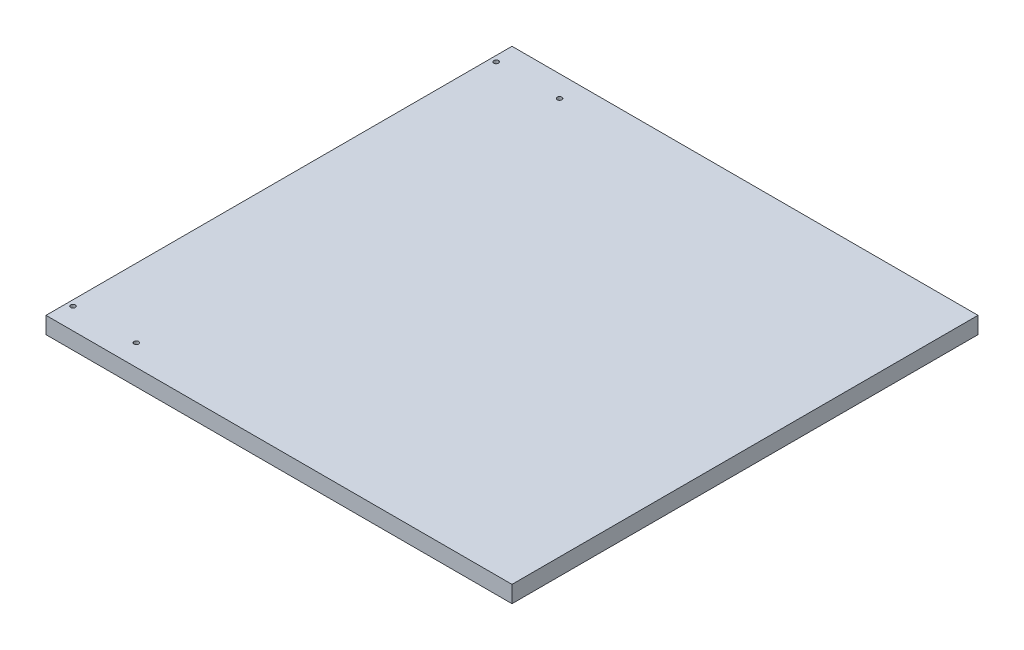
ISO-10303-21;
HEADER;
FILE_DESCRIPTION(('STEP AP214'),'2;1');
FILE_NAME('part.step','',(''),(''),'','','');
FILE_SCHEMA(('AUTOMOTIVE_DESIGN { 1 0 10303 214 1 1 1 1 }'));
ENDSEC;
DATA;
#1=APPLICATION_CONTEXT('core data for automotive mechanical design processes');
#2=APPLICATION_PROTOCOL_DEFINITION('international standard','automotive_design',2000,#1);
#3=PRODUCT_CONTEXT('',#1,'mechanical');
#4=PRODUCT('Part','Part','',(#3));
#5=PRODUCT_RELATED_PRODUCT_CATEGORY('part','',(#4));
#6=PRODUCT_DEFINITION_FORMATION('','',#4);
#7=PRODUCT_DEFINITION_CONTEXT('part definition',#1,'design');
#8=PRODUCT_DEFINITION('design','',#6,#7);
#9=PRODUCT_DEFINITION_SHAPE('','',#8);
#10=(LENGTH_UNIT() NAMED_UNIT(*) SI_UNIT(.MILLI.,.METRE.));
#11=(NAMED_UNIT(*) PLANE_ANGLE_UNIT() SI_UNIT($,.RADIAN.));
#12=(NAMED_UNIT(*) SI_UNIT($,.STERADIAN.) SOLID_ANGLE_UNIT());
#13=UNCERTAINTY_MEASURE_WITH_UNIT(LENGTH_MEASURE(1.E-05),#10,'distance_accuracy_value','');
#14=(GEOMETRIC_REPRESENTATION_CONTEXT(3) GLOBAL_UNCERTAINTY_ASSIGNED_CONTEXT((#13)) GLOBAL_UNIT_ASSIGNED_CONTEXT((#10,
#11,#12)) REPRESENTATION_CONTEXT('',''));
#15=CARTESIAN_POINT('',(0.,0.,0.));
#16=DIRECTION('',(0.,0.,1.));
#17=DIRECTION('',(1.,0.,0.));
#18=AXIS2_PLACEMENT_3D('',#15,#16,#17);
#19=CARTESIAN_POINT('',(-250.,9.,250.));
#20=DIRECTION('',(1.,0.,0.));
#21=DIRECTION('',(0.,0.,-1.));
#22=AXIS2_PLACEMENT_3D('',#19,#20,#21);
#23=PLANE('',#22);
#24=DIRECTION('',(0.,0.,1.));
#25=VECTOR('',#24,1.);
#26=CARTESIAN_POINT('',(-250.,-9.,250.));
#27=LINE('',#26,#25);
#28=CARTESIAN_POINT('',(-250.,-9.,-250.));
#29=VERTEX_POINT('',#28);
#30=CARTESIAN_POINT('',(-250.,-9.,250.));
#31=VERTEX_POINT('',#30);
#32=EDGE_CURVE('E108',#29,#31,#27,.T.);
#33=ORIENTED_EDGE('',*,*,#32,.T.);
#34=DIRECTION('',(0.,-1.,0.));
#35=VECTOR('',#34,1.);
#36=CARTESIAN_POINT('',(-250.,9.,250.));
#37=LINE('',#36,#35);
#38=CARTESIAN_POINT('',(-250.,9.,250.));
#39=VERTEX_POINT('',#38);
#40=EDGE_CURVE('E99',#39,#31,#37,.T.);
#41=ORIENTED_EDGE('',*,*,#40,.F.);
#42=DIRECTION('',(0.,0.,1.));
#43=VECTOR('',#42,1.);
#44=CARTESIAN_POINT('',(-250.,9.,250.));
#45=LINE('',#44,#43);
#46=CARTESIAN_POINT('',(-250.,9.,-250.));
#47=VERTEX_POINT('',#46);
#48=EDGE_CURVE('E93',#47,#39,#45,.T.);
#49=ORIENTED_EDGE('',*,*,#48,.F.);
#50=DIRECTION('',(0.,-1.,0.));
#51=VECTOR('',#50,1.);
#52=CARTESIAN_POINT('',(-250.,9.,-250.));
#53=LINE('',#52,#51);
#54=EDGE_CURVE('E104',#47,#29,#53,.T.);
#55=ORIENTED_EDGE('',*,*,#54,.T.);
#56=EDGE_LOOP('',(#33,#41,#49,#55));
#57=FACE_BOUND('',#56,.T.);
#58=ADVANCED_FACE('F40',(#57),#23,.F.);
#59=CARTESIAN_POINT('',(250.,9.,250.));
#60=DIRECTION('',(0.,0.,-1.));
#61=DIRECTION('',(-1.,0.,0.));
#62=AXIS2_PLACEMENT_3D('',#59,#60,#61);
#63=PLANE('',#62);
#64=DIRECTION('',(1.,0.,0.));
#65=VECTOR('',#64,1.);
#66=CARTESIAN_POINT('',(250.,-9.,250.));
#67=LINE('',#66,#65);
#68=CARTESIAN_POINT('',(250.,-9.,250.));
#69=VERTEX_POINT('',#68);
#70=EDGE_CURVE('E98',#31,#69,#67,.T.);
#71=ORIENTED_EDGE('',*,*,#70,.T.);
#72=DIRECTION('',(0.,-1.,0.));
#73=VECTOR('',#72,1.);
#74=CARTESIAN_POINT('',(250.,9.,250.));
#75=LINE('',#74,#73);
#76=CARTESIAN_POINT('',(250.,9.,250.));
#77=VERTEX_POINT('',#76);
#78=EDGE_CURVE('E96',#77,#69,#75,.T.);
#79=ORIENTED_EDGE('',*,*,#78,.F.);
#80=DIRECTION('',(1.,0.,0.));
#81=VECTOR('',#80,1.);
#82=CARTESIAN_POINT('',(250.,9.,250.));
#83=LINE('',#82,#81);
#84=EDGE_CURVE('E88',#39,#77,#83,.T.);
#85=ORIENTED_EDGE('',*,*,#84,.F.);
#86=ORIENTED_EDGE('',*,*,#40,.T.);
#87=EDGE_LOOP('',(#71,#79,#85,#86));
#88=FACE_BOUND('',#87,.T.);
#89=ADVANCED_FACE('F97',(#88),#63,.F.);
#90=CARTESIAN_POINT('',(250.,9.,250.));
#91=DIRECTION('',(-1.,0.,0.));
#92=DIRECTION('',(0.,0.,1.));
#93=AXIS2_PLACEMENT_3D('',#90,#91,#92);
#94=PLANE('',#93);
#95=DIRECTION('',(0.,0.,-1.));
#96=VECTOR('',#95,1.);
#97=CARTESIAN_POINT('',(250.,-9.,250.));
#98=LINE('',#97,#96);
#99=CARTESIAN_POINT('',(250.,-9.,-250.));
#100=VERTEX_POINT('',#99);
#101=EDGE_CURVE('E74',#69,#100,#98,.T.);
#102=ORIENTED_EDGE('',*,*,#101,.T.);
#103=DIRECTION('',(0.,-1.,0.));
#104=VECTOR('',#103,1.);
#105=CARTESIAN_POINT('',(250.,9.,-250.));
#106=LINE('',#105,#104);
#107=CARTESIAN_POINT('',(250.,9.,-250.));
#108=VERTEX_POINT('',#107);
#109=EDGE_CURVE('E100',#108,#100,#106,.T.);
#110=ORIENTED_EDGE('',*,*,#109,.F.);
#111=DIRECTION('',(0.,0.,-1.));
#112=VECTOR('',#111,1.);
#113=CARTESIAN_POINT('',(250.,9.,250.));
#114=LINE('',#113,#112);
#115=EDGE_CURVE('E91',#77,#108,#114,.T.);
#116=ORIENTED_EDGE('',*,*,#115,.F.);
#117=ORIENTED_EDGE('',*,*,#78,.T.);
#118=EDGE_LOOP('',(#102,#110,#116,#117));
#119=FACE_BOUND('',#118,.T.);
#120=ADVANCED_FACE('F102',(#119),#94,.F.);
#121=CARTESIAN_POINT('',(250.,9.,-250.));
#122=DIRECTION('',(0.,0.,1.));
#123=DIRECTION('',(1.,0.,0.));
#124=AXIS2_PLACEMENT_3D('',#121,#122,#123);
#125=PLANE('',#124);
#126=DIRECTION('',(-1.,0.,0.));
#127=VECTOR('',#126,1.);
#128=CARTESIAN_POINT('',(250.,-9.,-250.));
#129=LINE('',#128,#127);
#130=EDGE_CURVE('E80',#100,#29,#129,.T.);
#131=ORIENTED_EDGE('',*,*,#130,.T.);
#132=ORIENTED_EDGE('',*,*,#54,.F.);
#133=DIRECTION('',(-1.,0.,0.));
#134=VECTOR('',#133,1.);
#135=CARTESIAN_POINT('',(250.,9.,-250.));
#136=LINE('',#135,#134);
#137=EDGE_CURVE('E57',#108,#47,#136,.T.);
#138=ORIENTED_EDGE('',*,*,#137,.F.);
#139=ORIENTED_EDGE('',*,*,#109,.T.);
#140=EDGE_LOOP('',(#131,#132,#138,#139));
#141=FACE_BOUND('',#140,.T.);
#142=ADVANCED_FACE('F157',(#141),#125,.F.);
#143=CARTESIAN_POINT('',(0.,9.,0.));
#144=DIRECTION('',(0.,1.,0.));
#145=DIRECTION('',(0.,0.,1.));
#146=AXIS2_PLACEMENT_3D('',#143,#144,#145);
#147=PLANE('',#146);
#148=CARTESIAN_POINT('',(-244.,9.,-227.));
#149=DIRECTION('',(0.,1.,0.));
#150=DIRECTION('',(0.,0.,-1.));
#151=AXIS2_PLACEMENT_3D('',#148,#149,#150);
#152=CIRCLE('',#151,2.5);
#153=CARTESIAN_POINT('',(-244.,9.,-229.5));
#154=VERTEX_POINT('',#153);
#155=EDGE_CURVE('E194',#154,#154,#152,.T.);
#156=ORIENTED_EDGE('',*,*,#155,.F.);
#157=EDGE_LOOP('',(#156));
#158=FACE_BOUND('',#157,.T.);
#159=CARTESIAN_POINT('',(-176.,9.,-227.));
#160=DIRECTION('',(0.,1.,0.));
#161=DIRECTION('',(0.,0.,1.));
#162=AXIS2_PLACEMENT_3D('',#159,#160,#161);
#163=CIRCLE('',#162,2.5);
#164=CARTESIAN_POINT('',(-176.,9.,-224.5));
#165=VERTEX_POINT('',#164);
#166=EDGE_CURVE('E195',#165,#165,#163,.T.);
#167=ORIENTED_EDGE('',*,*,#166,.F.);
#168=EDGE_LOOP('',(#167));
#169=FACE_BOUND('',#168,.T.);
#170=CARTESIAN_POINT('',(-176.,9.,227.));
#171=DIRECTION('',(0.,1.,0.));
#172=DIRECTION('',(0.,0.,-1.));
#173=AXIS2_PLACEMENT_3D('',#170,#171,#172);
#174=CIRCLE('',#173,2.5);
#175=CARTESIAN_POINT('',(-176.,9.,224.5));
#176=VERTEX_POINT('',#175);
#177=EDGE_CURVE('E198',#176,#176,#174,.T.);
#178=ORIENTED_EDGE('',*,*,#177,.F.);
#179=EDGE_LOOP('',(#178));
#180=FACE_BOUND('',#179,.T.);
#181=CARTESIAN_POINT('',(-244.,9.,227.));
#182=DIRECTION('',(0.,1.,0.));
#183=DIRECTION('',(0.,0.,1.));
#184=AXIS2_PLACEMENT_3D('',#181,#182,#183);
#185=CIRCLE('',#184,2.5);
#186=CARTESIAN_POINT('',(-244.,9.,229.5));
#187=VERTEX_POINT('',#186);
#188=EDGE_CURVE('E111',#187,#187,#185,.T.);
#189=ORIENTED_EDGE('',*,*,#188,.F.);
#190=EDGE_LOOP('',(#189));
#191=FACE_BOUND('',#190,.T.);
#192=ORIENTED_EDGE('',*,*,#48,.T.);
#193=ORIENTED_EDGE('',*,*,#84,.T.);
#194=ORIENTED_EDGE('',*,*,#115,.T.);
#195=ORIENTED_EDGE('',*,*,#137,.T.);
#196=EDGE_LOOP('',(#192,#193,#194,#195));
#197=FACE_BOUND('',#196,.T.);
#198=ADVANCED_FACE('F89',(#158,#169,#180,#191,#197),#147,.T.);
#199=CARTESIAN_POINT('',(0.,-9.,0.));
#200=DIRECTION('',(0.,1.,0.));
#201=DIRECTION('',(0.,0.,1.));
#202=AXIS2_PLACEMENT_3D('',#199,#200,#201);
#203=PLANE('',#202);
#204=CARTESIAN_POINT('',(-176.,-9.,-227.));
#205=DIRECTION('',(0.,1.,0.));
#206=DIRECTION('',(0.,0.,1.));
#207=AXIS2_PLACEMENT_3D('',#204,#205,#206);
#208=CIRCLE('',#207,4.50000000000006);
#209=CARTESIAN_POINT('',(-176.,-9.,-222.5));
#210=VERTEX_POINT('',#209);
#211=EDGE_CURVE('E127',#210,#210,#208,.T.);
#212=ORIENTED_EDGE('',*,*,#211,.T.);
#213=EDGE_LOOP('',(#212));
#214=FACE_BOUND('',#213,.T.);
#215=CARTESIAN_POINT('',(-244.,-9.,-227.));
#216=DIRECTION('',(0.,1.,0.));
#217=DIRECTION('',(0.,0.,1.));
#218=AXIS2_PLACEMENT_3D('',#215,#216,#217);
#219=CIRCLE('',#218,4.50000000000006);
#220=CARTESIAN_POINT('',(-244.,-9.,-222.5));
#221=VERTEX_POINT('',#220);
#222=EDGE_CURVE('E124',#221,#221,#219,.T.);
#223=ORIENTED_EDGE('',*,*,#222,.T.);
#224=EDGE_LOOP('',(#223));
#225=FACE_BOUND('',#224,.T.);
#226=CARTESIAN_POINT('',(-176.,-9.,227.));
#227=DIRECTION('',(0.,1.,0.));
#228=DIRECTION('',(0.,0.,1.));
#229=AXIS2_PLACEMENT_3D('',#226,#227,#228);
#230=CIRCLE('',#229,4.50000000000006);
#231=CARTESIAN_POINT('',(-176.,-9.,231.5));
#232=VERTEX_POINT('',#231);
#233=EDGE_CURVE('E121',#232,#232,#230,.T.);
#234=ORIENTED_EDGE('',*,*,#233,.T.);
#235=EDGE_LOOP('',(#234));
#236=FACE_BOUND('',#235,.T.);
#237=CARTESIAN_POINT('',(-244.,-9.,227.));
#238=DIRECTION('',(0.,1.,0.));
#239=DIRECTION('',(0.,0.,1.));
#240=AXIS2_PLACEMENT_3D('',#237,#238,#239);
#241=CIRCLE('',#240,4.50000000000006);
#242=CARTESIAN_POINT('',(-244.,-9.,231.5));
#243=VERTEX_POINT('',#242);
#244=EDGE_CURVE('E118',#243,#243,#241,.T.);
#245=ORIENTED_EDGE('',*,*,#244,.T.);
#246=EDGE_LOOP('',(#245));
#247=FACE_BOUND('',#246,.T.);
#248=ORIENTED_EDGE('',*,*,#32,.F.);
#249=ORIENTED_EDGE('',*,*,#130,.F.);
#250=ORIENTED_EDGE('',*,*,#101,.F.);
#251=ORIENTED_EDGE('',*,*,#70,.F.);
#252=EDGE_LOOP('',(#248,#249,#250,#251));
#253=FACE_BOUND('',#252,.T.);
#254=ADVANCED_FACE('F147',(#214,#225,#236,#247,#253),#203,.F.);
#255=CARTESIAN_POINT('',(-244.,-9.,227.));
#256=DIRECTION('',(0.,1.,0.));
#257=DIRECTION('',(0.,0.,1.));
#258=AXIS2_PLACEMENT_3D('',#255,#256,#257);
#259=CYLINDRICAL_SURFACE('',#258,2.5);
#260=CARTESIAN_POINT('',(-244.,-6.99999999999998,227.));
#261=DIRECTION('',(0.,1.,0.));
#262=DIRECTION('',(0.,0.,1.));
#263=AXIS2_PLACEMENT_3D('',#260,#261,#262);
#264=CIRCLE('',#263,2.5);
#265=CARTESIAN_POINT('',(-244.,-6.99999999999998,229.5));
#266=VERTEX_POINT('',#265);
#267=EDGE_CURVE('E11',#266,#266,#264,.F.);
#268=ORIENTED_EDGE('',*,*,#267,.T.);
#269=EDGE_LOOP('',(#268));
#270=FACE_BOUND('',#269,.T.);
#271=ORIENTED_EDGE('',*,*,#188,.T.);
#272=EDGE_LOOP('',(#271));
#273=FACE_BOUND('',#272,.T.);
#274=ADVANCED_FACE('F150',(#270,#273),#259,.F.);
#275=CARTESIAN_POINT('',(-176.,-9.,227.));
#276=DIRECTION('',(0.,1.,0.));
#277=DIRECTION('',(0.,0.,1.));
#278=AXIS2_PLACEMENT_3D('',#275,#276,#277);
#279=CYLINDRICAL_SURFACE('',#278,2.5);
#280=CARTESIAN_POINT('',(-176.,-6.99999999999998,227.));
#281=DIRECTION('',(0.,1.,0.));
#282=DIRECTION('',(0.,0.,1.));
#283=AXIS2_PLACEMENT_3D('',#280,#281,#282);
#284=CIRCLE('',#283,2.5);
#285=CARTESIAN_POINT('',(-176.,-6.99999999999998,229.5));
#286=VERTEX_POINT('',#285);
#287=EDGE_CURVE('E49',#286,#286,#284,.F.);
#288=ORIENTED_EDGE('',*,*,#287,.T.);
#289=EDGE_LOOP('',(#288));
#290=FACE_BOUND('',#289,.T.);
#291=ORIENTED_EDGE('',*,*,#177,.T.);
#292=EDGE_LOOP('',(#291));
#293=FACE_BOUND('',#292,.T.);
#294=ADVANCED_FACE('F138',(#290,#293),#279,.F.);
#295=CARTESIAN_POINT('',(-176.,-9.,-227.));
#296=DIRECTION('',(0.,1.,0.));
#297=DIRECTION('',(0.,0.,1.));
#298=AXIS2_PLACEMENT_3D('',#295,#296,#297);
#299=CYLINDRICAL_SURFACE('',#298,2.5);
#300=CARTESIAN_POINT('',(-176.,-6.99999999999998,-227.));
#301=DIRECTION('',(0.,1.,0.));
#302=DIRECTION('',(0.,0.,1.));
#303=AXIS2_PLACEMENT_3D('',#300,#301,#302);
#304=CIRCLE('',#303,2.5);
#305=CARTESIAN_POINT('',(-176.,-6.99999999999998,-224.5));
#306=VERTEX_POINT('',#305);
#307=EDGE_CURVE('E130',#306,#306,#304,.F.);
#308=ORIENTED_EDGE('',*,*,#307,.T.);
#309=EDGE_LOOP('',(#308));
#310=FACE_BOUND('',#309,.T.);
#311=ORIENTED_EDGE('',*,*,#166,.T.);
#312=EDGE_LOOP('',(#311));
#313=FACE_BOUND('',#312,.T.);
#314=ADVANCED_FACE('F190',(#310,#313),#299,.F.);
#315=CARTESIAN_POINT('',(-244.,-9.,-227.));
#316=DIRECTION('',(0.,1.,0.));
#317=DIRECTION('',(0.,0.,1.));
#318=AXIS2_PLACEMENT_3D('',#315,#316,#317);
#319=CYLINDRICAL_SURFACE('',#318,2.5);
#320=CARTESIAN_POINT('',(-244.,-6.99999999999998,-227.));
#321=DIRECTION('',(0.,1.,0.));
#322=DIRECTION('',(0.,0.,1.));
#323=AXIS2_PLACEMENT_3D('',#320,#321,#322);
#324=CIRCLE('',#323,2.5);
#325=CARTESIAN_POINT('',(-244.,-6.99999999999998,-224.5));
#326=VERTEX_POINT('',#325);
#327=EDGE_CURVE('E133',#326,#326,#324,.F.);
#328=ORIENTED_EDGE('',*,*,#327,.T.);
#329=EDGE_LOOP('',(#328));
#330=FACE_BOUND('',#329,.T.);
#331=ORIENTED_EDGE('',*,*,#155,.T.);
#332=EDGE_LOOP('',(#331));
#333=FACE_BOUND('',#332,.T.);
#334=ADVANCED_FACE('F177',(#330,#333),#319,.F.);
#335=CARTESIAN_POINT('',(-176.,-9.,-227.));
#336=DIRECTION('',(0.,-1.,0.));
#337=DIRECTION('',(0.,0.,-1.));
#338=AXIS2_PLACEMENT_3D('',#335,#336,#337);
#339=CONICAL_SURFACE('',#338,4.50000000000006,0.78539816339746);
#340=ORIENTED_EDGE('',*,*,#307,.F.);
#341=EDGE_LOOP('',(#340));
#342=FACE_BOUND('',#341,.T.);
#343=ORIENTED_EDGE('',*,*,#211,.F.);
#344=EDGE_LOOP('',(#343));
#345=FACE_BOUND('',#344,.T.);
#346=ADVANCED_FACE('F174',(#342,#345),#339,.F.);
#347=CARTESIAN_POINT('',(-244.,-9.,-227.));
#348=DIRECTION('',(0.,-1.,0.));
#349=DIRECTION('',(0.,0.,-1.));
#350=AXIS2_PLACEMENT_3D('',#347,#348,#349);
#351=CONICAL_SURFACE('',#350,4.50000000000006,0.78539816339746);
#352=ORIENTED_EDGE('',*,*,#327,.F.);
#353=EDGE_LOOP('',(#352));
#354=FACE_BOUND('',#353,.T.);
#355=ORIENTED_EDGE('',*,*,#222,.F.);
#356=EDGE_LOOP('',(#355));
#357=FACE_BOUND('',#356,.T.);
#358=ADVANCED_FACE('F144',(#354,#357),#351,.F.);
#359=CARTESIAN_POINT('',(-176.,-9.,227.));
#360=DIRECTION('',(0.,-1.,0.));
#361=DIRECTION('',(0.,0.,-1.));
#362=AXIS2_PLACEMENT_3D('',#359,#360,#361);
#363=CONICAL_SURFACE('',#362,4.50000000000006,0.78539816339746);
#364=ORIENTED_EDGE('',*,*,#287,.F.);
#365=EDGE_LOOP('',(#364));
#366=FACE_BOUND('',#365,.T.);
#367=ORIENTED_EDGE('',*,*,#233,.F.);
#368=EDGE_LOOP('',(#367));
#369=FACE_BOUND('',#368,.T.);
#370=ADVANCED_FACE('F141',(#366,#369),#363,.F.);
#371=CARTESIAN_POINT('',(-244.,-9.,227.));
#372=DIRECTION('',(0.,-1.,0.));
#373=DIRECTION('',(0.,0.,-1.));
#374=AXIS2_PLACEMENT_3D('',#371,#372,#373);
#375=CONICAL_SURFACE('',#374,4.50000000000006,0.78539816339746);
#376=ORIENTED_EDGE('',*,*,#267,.F.);
#377=EDGE_LOOP('',(#376));
#378=FACE_BOUND('',#377,.T.);
#379=ORIENTED_EDGE('',*,*,#244,.F.);
#380=EDGE_LOOP('',(#379));
#381=FACE_BOUND('',#380,.T.);
#382=ADVANCED_FACE('F42',(#378,#381),#375,.F.);
#383=CLOSED_SHELL('',(#58,#89,#120,#142,#198,#254,#274,#294,#314,#334,#346,#358,#370,#382));
#384=MANIFOLD_SOLID_BREP('B2',#383);
#385=ADVANCED_BREP_SHAPE_REPRESENTATION('',(#18,#384),#14);
#386=SHAPE_DEFINITION_REPRESENTATION(#9,#385);
ENDSEC;
END-ISO-10303-21;
